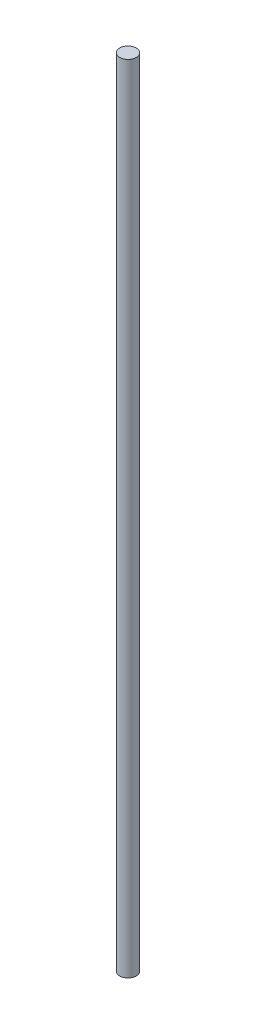
ISO-10303-21;
HEADER;
FILE_DESCRIPTION(('STEP AP214'),'2;1');
FILE_NAME('part.step','',(''),(''),'','','');
FILE_SCHEMA(('AUTOMOTIVE_DESIGN { 1 0 10303 214 1 1 1 1 }'));
ENDSEC;
DATA;
#1=APPLICATION_CONTEXT('core data for automotive mechanical design processes');
#2=APPLICATION_PROTOCOL_DEFINITION('international standard','automotive_design',2000,#1);
#3=PRODUCT_CONTEXT('',#1,'mechanical');
#4=PRODUCT('Part','Part','',(#3));
#5=PRODUCT_RELATED_PRODUCT_CATEGORY('part','',(#4));
#6=PRODUCT_DEFINITION_FORMATION('','',#4);
#7=PRODUCT_DEFINITION_CONTEXT('part definition',#1,'design');
#8=PRODUCT_DEFINITION('design','',#6,#7);
#9=PRODUCT_DEFINITION_SHAPE('','',#8);
#10=(LENGTH_UNIT() NAMED_UNIT(*) SI_UNIT(.MILLI.,.METRE.));
#11=(NAMED_UNIT(*) PLANE_ANGLE_UNIT() SI_UNIT($,.RADIAN.));
#12=(NAMED_UNIT(*) SI_UNIT($,.STERADIAN.) SOLID_ANGLE_UNIT());
#13=UNCERTAINTY_MEASURE_WITH_UNIT(LENGTH_MEASURE(1.E-05),#10,'distance_accuracy_value','');
#14=(GEOMETRIC_REPRESENTATION_CONTEXT(3) GLOBAL_UNCERTAINTY_ASSIGNED_CONTEXT((#13)) GLOBAL_UNIT_ASSIGNED_CONTEXT((#10,
#11,#12)) REPRESENTATION_CONTEXT('',''));
#15=CARTESIAN_POINT('',(0.,0.,0.));
#16=DIRECTION('',(0.,0.,1.));
#17=DIRECTION('',(1.,0.,0.));
#18=AXIS2_PLACEMENT_3D('',#15,#16,#17);
#19=CARTESIAN_POINT('',(0.,386.26,0.));
#20=DIRECTION('',(0.,-1.,0.));
#21=DIRECTION('',(0.,0.,-1.));
#22=AXIS2_PLACEMENT_3D('',#19,#20,#21);
#23=CYLINDRICAL_SURFACE('',#22,4.);
#24=CARTESIAN_POINT('',(0.,386.26,0.));
#25=DIRECTION('',(0.,1.,0.));
#26=DIRECTION('',(0.,0.,1.));
#27=AXIS2_PLACEMENT_3D('',#24,#25,#26);
#28=CIRCLE('',#27,4.);
#29=CARTESIAN_POINT('',(0.,386.26,4.));
#30=VERTEX_POINT('',#29);
#31=EDGE_CURVE('E10',#30,#30,#28,.T.);
#32=ORIENTED_EDGE('',*,*,#31,.F.);
#33=EDGE_LOOP('',(#32));
#34=FACE_BOUND('',#33,.T.);
#35=CARTESIAN_POINT('',(0.,0.,0.));
#36=DIRECTION('',(0.,1.,0.));
#37=DIRECTION('',(0.,0.,1.));
#38=AXIS2_PLACEMENT_3D('',#35,#36,#37);
#39=CIRCLE('',#38,4.);
#40=CARTESIAN_POINT('',(0.,0.,4.));
#41=VERTEX_POINT('',#40);
#42=EDGE_CURVE('E36',#41,#41,#39,.T.);
#43=ORIENTED_EDGE('',*,*,#42,.T.);
#44=EDGE_LOOP('',(#43));
#45=FACE_BOUND('',#44,.T.);
#46=ADVANCED_FACE('F33',(#34,#45),#23,.T.);
#47=CARTESIAN_POINT('',(0.,386.26,0.));
#48=DIRECTION('',(0.,1.,0.));
#49=DIRECTION('',(0.,0.,1.));
#50=AXIS2_PLACEMENT_3D('',#47,#48,#49);
#51=PLANE('',#50);
#52=ORIENTED_EDGE('',*,*,#31,.T.);
#53=EDGE_LOOP('',(#52));
#54=FACE_BOUND('',#53,.T.);
#55=ADVANCED_FACE('F48',(#54),#51,.T.);
#56=CARTESIAN_POINT('',(0.,0.,0.));
#57=DIRECTION('',(0.,1.,0.));
#58=DIRECTION('',(0.,0.,1.));
#59=AXIS2_PLACEMENT_3D('',#56,#57,#58);
#60=PLANE('',#59);
#61=ORIENTED_EDGE('',*,*,#42,.F.);
#62=EDGE_LOOP('',(#61));
#63=FACE_BOUND('',#62,.T.);
#64=ADVANCED_FACE('F46',(#63),#60,.F.);
#65=CLOSED_SHELL('',(#46,#55,#64));
#66=MANIFOLD_SOLID_BREP('B2',#65);
#67=ADVANCED_BREP_SHAPE_REPRESENTATION('',(#18,#66),#14);
#68=SHAPE_DEFINITION_REPRESENTATION(#9,#67);
ENDSEC;
END-ISO-10303-21;
